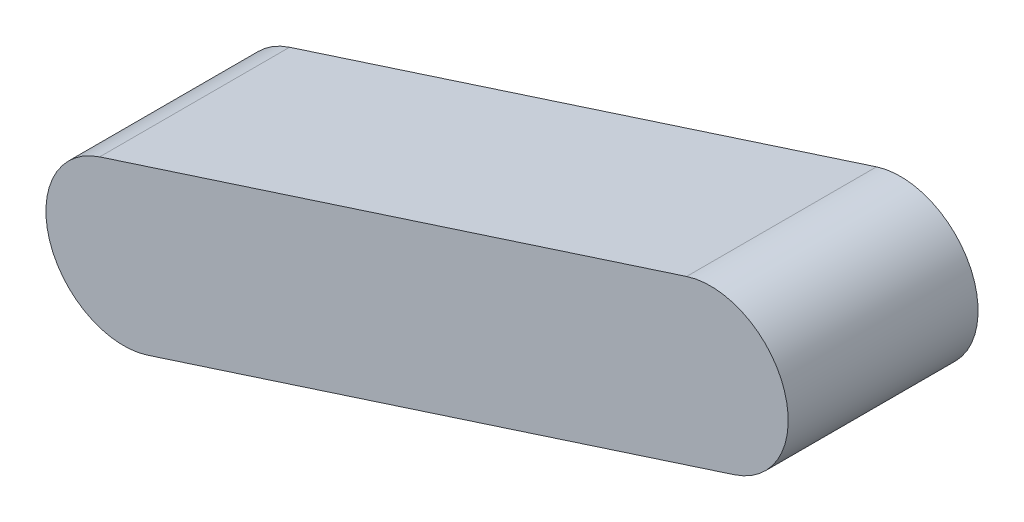
ISO-10303-21;
HEADER;
FILE_DESCRIPTION(('STEP AP214'),'2;1');
FILE_NAME('part.step','',(''),(''),'','','');
FILE_SCHEMA(('AUTOMOTIVE_DESIGN { 1 0 10303 214 1 1 1 1 }'));
ENDSEC;
DATA;
#1=APPLICATION_CONTEXT('core data for automotive mechanical design processes');
#2=APPLICATION_PROTOCOL_DEFINITION('international standard','automotive_design',2000,#1);
#3=PRODUCT_CONTEXT('',#1,'mechanical');
#4=PRODUCT('Part','Part','',(#3));
#5=PRODUCT_RELATED_PRODUCT_CATEGORY('part','',(#4));
#6=PRODUCT_DEFINITION_FORMATION('','',#4);
#7=PRODUCT_DEFINITION_CONTEXT('part definition',#1,'design');
#8=PRODUCT_DEFINITION('design','',#6,#7);
#9=PRODUCT_DEFINITION_SHAPE('','',#8);
#10=(LENGTH_UNIT() NAMED_UNIT(*) SI_UNIT(.MILLI.,.METRE.));
#11=(NAMED_UNIT(*) PLANE_ANGLE_UNIT() SI_UNIT($,.RADIAN.));
#12=(NAMED_UNIT(*) SI_UNIT($,.STERADIAN.) SOLID_ANGLE_UNIT());
#13=UNCERTAINTY_MEASURE_WITH_UNIT(LENGTH_MEASURE(1.E-05),#10,'distance_accuracy_value','');
#14=(GEOMETRIC_REPRESENTATION_CONTEXT(3) GLOBAL_UNCERTAINTY_ASSIGNED_CONTEXT((#13)) GLOBAL_UNIT_ASSIGNED_CONTEXT((#10,
#11,#12)) REPRESENTATION_CONTEXT('',''));
#15=CARTESIAN_POINT('',(0.,0.,0.));
#16=DIRECTION('',(0.,0.,1.));
#17=DIRECTION('',(1.,0.,0.));
#18=AXIS2_PLACEMENT_3D('',#15,#16,#17);
#19=CARTESIAN_POINT('',(3.,5.,11.));
#20=DIRECTION('',(0.,0.,-1.));
#21=DIRECTION('',(-1.,0.,0.));
#22=AXIS2_PLACEMENT_3D('',#19,#20,#21);
#23=CYLINDRICAL_SURFACE('',#22,4.5);
#24=CARTESIAN_POINT('',(3.,5.,0.));
#25=DIRECTION('',(0.,0.,1.));
#26=DIRECTION('',(1.,0.,0.));
#27=AXIS2_PLACEMENT_3D('',#24,#25,#26);
#28=CIRCLE('',#27,4.5);
#29=CARTESIAN_POINT('',(1.61480871563402,9.28150033349485,0.));
#30=VERTEX_POINT('',#29);
#31=CARTESIAN_POINT('',(4.38519128436598,0.718499666505148,0.));
#32=VERTEX_POINT('',#31);
#33=EDGE_CURVE('E104',#30,#32,#28,.T.);
#34=ORIENTED_EDGE('',*,*,#33,.T.);
#35=DIRECTION('',(0.,0.,-1.));
#36=VECTOR('',#35,1.);
#37=CARTESIAN_POINT('',(4.38519128436598,0.718499666505148,11.));
#38=LINE('',#37,#36);
#39=CARTESIAN_POINT('',(4.38519128436598,0.718499666505148,11.));
#40=VERTEX_POINT('',#39);
#41=EDGE_CURVE('E11',#40,#32,#38,.T.);
#42=ORIENTED_EDGE('',*,*,#41,.F.);
#43=CARTESIAN_POINT('',(3.,5.,11.));
#44=DIRECTION('',(0.,0.,1.));
#45=DIRECTION('',(1.,0.,0.));
#46=AXIS2_PLACEMENT_3D('',#43,#44,#45);
#47=CIRCLE('',#46,4.5);
#48=CARTESIAN_POINT('',(1.61480871563402,9.28150033349485,11.));
#49=VERTEX_POINT('',#48);
#50=EDGE_CURVE('E92',#49,#40,#47,.T.);
#51=ORIENTED_EDGE('',*,*,#50,.F.);
#52=DIRECTION('',(0.,0.,-1.));
#53=VECTOR('',#52,1.);
#54=CARTESIAN_POINT('',(1.61480871563402,9.28150033349485,11.));
#55=LINE('',#54,#53);
#56=EDGE_CURVE('E100',#49,#30,#55,.T.);
#57=ORIENTED_EDGE('',*,*,#56,.T.);
#58=EDGE_LOOP('',(#34,#42,#51,#57));
#59=FACE_BOUND('',#58,.T.);
#60=ADVANCED_FACE('F41',(#59),#23,.T.);
#61=CARTESIAN_POINT('',(4.38519128436598,0.718499666505148,11.));
#62=DIRECTION('',(-0.307820285414663,0.951444518554411,0.));
#63=DIRECTION('',(-0.951444518554411,-0.307820285414663,0.));
#64=AXIS2_PLACEMENT_3D('',#61,#62,#63);
#65=PLANE('',#64);
#66=DIRECTION('',(0.951444518554411,0.307820285414663,0.));
#67=VECTOR('',#66,1.);
#68=CARTESIAN_POINT('',(4.38519128436598,0.718499666505148,0.));
#69=LINE('',#68,#67);
#70=CARTESIAN_POINT('',(38.385191284366,11.7184996665051,0.));
#71=VERTEX_POINT('',#70);
#72=EDGE_CURVE('E96',#32,#71,#69,.T.);
#73=ORIENTED_EDGE('',*,*,#72,.T.);
#74=DIRECTION('',(0.,0.,-1.));
#75=VECTOR('',#74,1.);
#76=CARTESIAN_POINT('',(38.385191284366,11.7184996665051,11.));
#77=LINE('',#76,#75);
#78=CARTESIAN_POINT('',(38.385191284366,11.7184996665051,11.));
#79=VERTEX_POINT('',#78);
#80=EDGE_CURVE('E49',#79,#71,#77,.T.);
#81=ORIENTED_EDGE('',*,*,#80,.F.);
#82=DIRECTION('',(0.951444518554411,0.307820285414663,0.));
#83=VECTOR('',#82,1.);
#84=CARTESIAN_POINT('',(4.38519128436598,0.718499666505148,11.));
#85=LINE('',#84,#83);
#86=EDGE_CURVE('E87',#40,#79,#85,.T.);
#87=ORIENTED_EDGE('',*,*,#86,.F.);
#88=ORIENTED_EDGE('',*,*,#41,.T.);
#89=EDGE_LOOP('',(#73,#81,#87,#88));
#90=FACE_BOUND('',#89,.T.);
#91=ADVANCED_FACE('F95',(#90),#65,.F.);
#92=CARTESIAN_POINT('',(37.,16.,11.));
#93=DIRECTION('',(0.,0.,-1.));
#94=DIRECTION('',(-1.,0.,0.));
#95=AXIS2_PLACEMENT_3D('',#92,#93,#94);
#96=CYLINDRICAL_SURFACE('',#95,4.5);
#97=CARTESIAN_POINT('',(37.,16.,0.));
#98=DIRECTION('',(0.,0.,1.));
#99=DIRECTION('',(1.,0.,0.));
#100=AXIS2_PLACEMENT_3D('',#97,#98,#99);
#101=CIRCLE('',#100,4.5);
#102=CARTESIAN_POINT('',(35.614808715634,20.2815003334949,0.));
#103=VERTEX_POINT('',#102);
#104=EDGE_CURVE('E74',#71,#103,#101,.T.);
#105=ORIENTED_EDGE('',*,*,#104,.T.);
#106=DIRECTION('',(0.,0.,-1.));
#107=VECTOR('',#106,1.);
#108=CARTESIAN_POINT('',(35.614808715634,20.2815003334949,11.));
#109=LINE('',#108,#107);
#110=CARTESIAN_POINT('',(35.614808715634,20.2815003334949,11.));
#111=VERTEX_POINT('',#110);
#112=EDGE_CURVE('E97',#111,#103,#109,.T.);
#113=ORIENTED_EDGE('',*,*,#112,.F.);
#114=CARTESIAN_POINT('',(37.,16.,11.));
#115=DIRECTION('',(0.,0.,1.));
#116=DIRECTION('',(1.,0.,0.));
#117=AXIS2_PLACEMENT_3D('',#114,#115,#116);
#118=CIRCLE('',#117,4.5);
#119=EDGE_CURVE('E90',#79,#111,#118,.T.);
#120=ORIENTED_EDGE('',*,*,#119,.F.);
#121=ORIENTED_EDGE('',*,*,#80,.T.);
#122=EDGE_LOOP('',(#105,#113,#120,#121));
#123=FACE_BOUND('',#122,.T.);
#124=ADVANCED_FACE('F98',(#123),#96,.T.);
#125=CARTESIAN_POINT('',(35.614808715634,20.2815003334949,11.));
#126=DIRECTION('',(0.307820285414662,-0.951444518554411,0.));
#127=DIRECTION('',(0.951444518554411,0.307820285414662,0.));
#128=AXIS2_PLACEMENT_3D('',#125,#126,#127);
#129=PLANE('',#128);
#130=DIRECTION('',(-0.951444518554411,-0.307820285414662,0.));
#131=VECTOR('',#130,1.);
#132=CARTESIAN_POINT('',(35.614808715634,20.2815003334949,0.));
#133=LINE('',#132,#131);
#134=EDGE_CURVE('E80',#103,#30,#133,.T.);
#135=ORIENTED_EDGE('',*,*,#134,.T.);
#136=ORIENTED_EDGE('',*,*,#56,.F.);
#137=DIRECTION('',(-0.951444518554411,-0.307820285414662,0.));
#138=VECTOR('',#137,1.);
#139=CARTESIAN_POINT('',(35.614808715634,20.2815003334949,11.));
#140=LINE('',#139,#138);
#141=EDGE_CURVE('E57',#111,#49,#140,.T.);
#142=ORIENTED_EDGE('',*,*,#141,.F.);
#143=ORIENTED_EDGE('',*,*,#112,.T.);
#144=EDGE_LOOP('',(#135,#136,#142,#143));
#145=FACE_BOUND('',#144,.T.);
#146=ADVANCED_FACE('F111',(#145),#129,.F.);
#147=CARTESIAN_POINT('',(3.,5.,11.));
#148=DIRECTION('',(0.,0.,1.));
#149=DIRECTION('',(1.,0.,0.));
#150=AXIS2_PLACEMENT_3D('',#147,#148,#149);
#151=PLANE('',#150);
#152=ORIENTED_EDGE('',*,*,#50,.T.);
#153=ORIENTED_EDGE('',*,*,#86,.T.);
#154=ORIENTED_EDGE('',*,*,#119,.T.);
#155=ORIENTED_EDGE('',*,*,#141,.T.);
#156=EDGE_LOOP('',(#152,#153,#154,#155));
#157=FACE_BOUND('',#156,.T.);
#158=ADVANCED_FACE('F88',(#157),#151,.T.);
#159=CARTESIAN_POINT('',(3.,5.,0.));
#160=DIRECTION('',(0.,0.,1.));
#161=DIRECTION('',(1.,0.,0.));
#162=AXIS2_PLACEMENT_3D('',#159,#160,#161);
#163=PLANE('',#162);
#164=ORIENTED_EDGE('',*,*,#33,.F.);
#165=ORIENTED_EDGE('',*,*,#134,.F.);
#166=ORIENTED_EDGE('',*,*,#104,.F.);
#167=ORIENTED_EDGE('',*,*,#72,.F.);
#168=EDGE_LOOP('',(#164,#165,#166,#167));
#169=FACE_BOUND('',#168,.T.);
#170=ADVANCED_FACE('F114',(#169),#163,.F.);
#171=CLOSED_SHELL('',(#60,#91,#124,#146,#158,#170));
#172=MANIFOLD_SOLID_BREP('B2',#171);
#173=ADVANCED_BREP_SHAPE_REPRESENTATION('',(#18,#172),#14);
#174=SHAPE_DEFINITION_REPRESENTATION(#9,#173);
ENDSEC;
END-ISO-10303-21;
